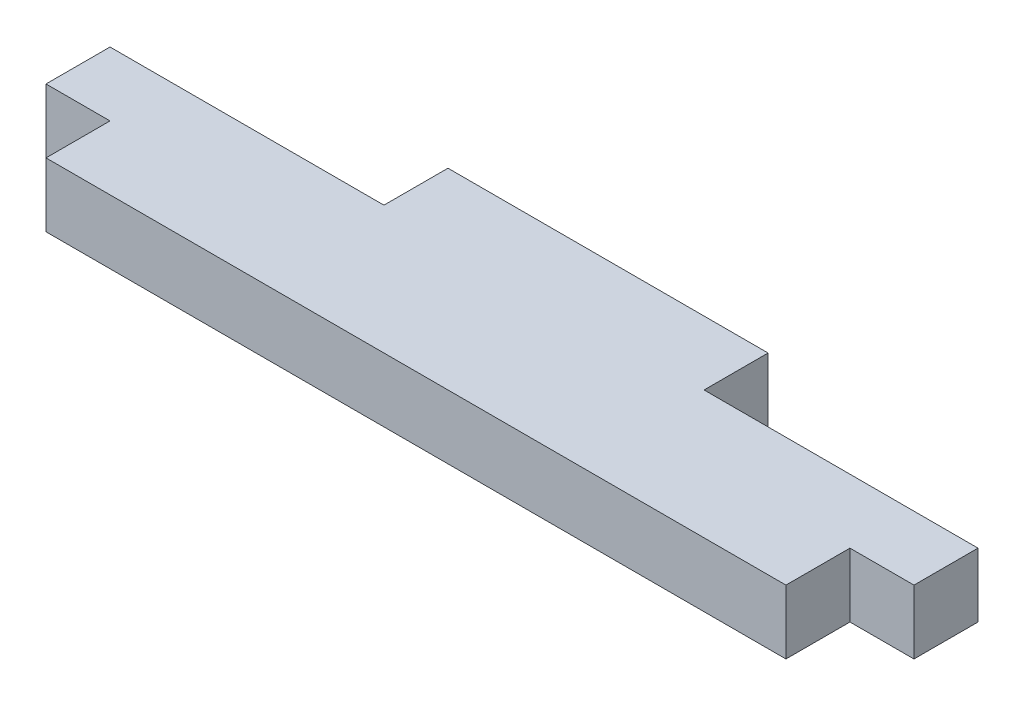
ISO-10303-21;
HEADER;
FILE_DESCRIPTION(('STEP AP214'),'2;1');
FILE_NAME('part.step','',(''),(''),'','','');
FILE_SCHEMA(('AUTOMOTIVE_DESIGN { 1 0 10303 214 1 1 1 1 }'));
ENDSEC;
DATA;
#1=APPLICATION_CONTEXT('core data for automotive mechanical design processes');
#2=APPLICATION_PROTOCOL_DEFINITION('international standard','automotive_design',2000,#1);
#3=PRODUCT_CONTEXT('',#1,'mechanical');
#4=PRODUCT('Part','Part','',(#3));
#5=PRODUCT_RELATED_PRODUCT_CATEGORY('part','',(#4));
#6=PRODUCT_DEFINITION_FORMATION('','',#4);
#7=PRODUCT_DEFINITION_CONTEXT('part definition',#1,'design');
#8=PRODUCT_DEFINITION('design','',#6,#7);
#9=PRODUCT_DEFINITION_SHAPE('','',#8);
#10=(LENGTH_UNIT() NAMED_UNIT(*) SI_UNIT(.MILLI.,.METRE.));
#11=(NAMED_UNIT(*) PLANE_ANGLE_UNIT() SI_UNIT($,.RADIAN.));
#12=(NAMED_UNIT(*) SI_UNIT($,.STERADIAN.) SOLID_ANGLE_UNIT());
#13=UNCERTAINTY_MEASURE_WITH_UNIT(LENGTH_MEASURE(1.E-05),#10,'distance_accuracy_value','');
#14=(GEOMETRIC_REPRESENTATION_CONTEXT(3) GLOBAL_UNCERTAINTY_ASSIGNED_CONTEXT((#13)) GLOBAL_UNIT_ASSIGNED_CONTEXT((#10,
#11,#12)) REPRESENTATION_CONTEXT('',''));
#15=CARTESIAN_POINT('',(0.,0.,0.));
#16=DIRECTION('',(0.,0.,1.));
#17=DIRECTION('',(1.,0.,0.));
#18=AXIS2_PLACEMENT_3D('',#15,#16,#17);
#19=CARTESIAN_POINT('',(0.,0.,0.));
#20=DIRECTION('',(0.,0.,1.));
#21=DIRECTION('',(1.,0.,0.));
#22=AXIS2_PLACEMENT_3D('',#19,#20,#21);
#23=PLANE('',#22);
#24=DIRECTION('',(0.,-1.,0.));
#25=VECTOR('',#24,1.);
#26=CARTESIAN_POINT('',(12.5,-45.,0.));
#27=LINE('',#26,#25);
#28=CARTESIAN_POINT('',(12.5,-45.,0.));
#29=VERTEX_POINT('',#28);
#30=CARTESIAN_POINT('',(12.5,-50.,0.));
#31=VERTEX_POINT('',#30);
#32=EDGE_CURVE('E124',#29,#31,#27,.T.);
#33=ORIENTED_EDGE('',*,*,#32,.F.);
#34=DIRECTION('',(-1.,0.,0.));
#35=VECTOR('',#34,1.);
#36=CARTESIAN_POINT('',(-33.8940421663747,-45.,0.));
#37=LINE('',#36,#35);
#38=CARTESIAN_POINT('',(33.8940421663747,-45.,0.));
#39=VERTEX_POINT('',#38);
#40=EDGE_CURVE('E138',#39,#29,#37,.T.);
#41=ORIENTED_EDGE('',*,*,#40,.F.);
#42=DIRECTION('',(0.,1.,0.));
#43=VECTOR('',#42,1.);
#44=CARTESIAN_POINT('',(33.8940421663747,-45.,0.));
#45=LINE('',#44,#43);
#46=CARTESIAN_POINT('',(33.8940421663747,-50.,0.));
#47=VERTEX_POINT('',#46);
#48=EDGE_CURVE('E154',#47,#39,#45,.T.);
#49=ORIENTED_EDGE('',*,*,#48,.F.);
#50=DIRECTION('',(1.,0.,0.));
#51=VECTOR('',#50,1.);
#52=CARTESIAN_POINT('',(-33.8940421663747,-50.,0.));
#53=LINE('',#52,#51);
#54=EDGE_CURVE('E139',#31,#47,#53,.T.);
#55=ORIENTED_EDGE('',*,*,#54,.F.);
#56=EDGE_LOOP('',(#33,#41,#49,#55));
#57=FACE_BOUND('',#56,.T.);
#58=ADVANCED_FACE('F32',(#57),#23,.F.);
#59=CARTESIAN_POINT('',(0.,0.,5.));
#60=DIRECTION('',(0.,0.,1.));
#61=DIRECTION('',(1.,0.,0.));
#62=AXIS2_PLACEMENT_3D('',#59,#60,#61);
#63=PLANE('',#62);
#64=DIRECTION('',(0.,-1.,0.));
#65=VECTOR('',#64,1.);
#66=CARTESIAN_POINT('',(-28.8940421663747,-45.,5.));
#67=LINE('',#66,#65);
#68=CARTESIAN_POINT('',(-28.8940421663747,-45.,5.));
#69=VERTEX_POINT('',#68);
#70=CARTESIAN_POINT('',(-28.8940421663747,-50.,5.));
#71=VERTEX_POINT('',#70);
#72=EDGE_CURVE('E55',#69,#71,#67,.T.);
#73=ORIENTED_EDGE('',*,*,#72,.F.);
#74=DIRECTION('',(-1.,0.,0.));
#75=VECTOR('',#74,1.);
#76=CARTESIAN_POINT('',(-33.8940421663747,-45.,5.));
#77=LINE('',#76,#75);
#78=CARTESIAN_POINT('',(-33.8940421663747,-45.,5.));
#79=VERTEX_POINT('',#78);
#80=EDGE_CURVE('E178',#69,#79,#77,.T.);
#81=ORIENTED_EDGE('',*,*,#80,.T.);
#82=DIRECTION('',(0.,-1.,0.));
#83=VECTOR('',#82,1.);
#84=CARTESIAN_POINT('',(-33.8940421663747,-45.,5.));
#85=LINE('',#84,#83);
#86=CARTESIAN_POINT('',(-33.8940421663747,-50.,5.));
#87=VERTEX_POINT('',#86);
#88=EDGE_CURVE('E148',#79,#87,#85,.T.);
#89=ORIENTED_EDGE('',*,*,#88,.T.);
#90=DIRECTION('',(1.,0.,0.));
#91=VECTOR('',#90,1.);
#92=CARTESIAN_POINT('',(-33.8940421663747,-50.,5.));
#93=LINE('',#92,#91);
#94=EDGE_CURVE('E180',#87,#71,#93,.T.);
#95=ORIENTED_EDGE('',*,*,#94,.T.);
#96=EDGE_LOOP('',(#73,#81,#89,#95));
#97=FACE_BOUND('',#96,.T.);
#98=ADVANCED_FACE('F230',(#97),#63,.T.);
#99=CARTESIAN_POINT('',(-33.8940421663747,-45.,5.));
#100=DIRECTION('',(1.,0.,0.));
#101=DIRECTION('',(0.,0.,-1.));
#102=AXIS2_PLACEMENT_3D('',#99,#100,#101);
#103=PLANE('',#102);
#104=DIRECTION('',(0.,-1.,0.));
#105=VECTOR('',#104,1.);
#106=CARTESIAN_POINT('',(-33.8940421663747,-45.,0.));
#107=LINE('',#106,#105);
#108=CARTESIAN_POINT('',(-33.8940421663747,-45.,0.));
#109=VERTEX_POINT('',#108);
#110=CARTESIAN_POINT('',(-33.8940421663747,-50.,0.));
#111=VERTEX_POINT('',#110);
#112=EDGE_CURVE('E172',#109,#111,#107,.T.);
#113=ORIENTED_EDGE('',*,*,#112,.T.);
#114=DIRECTION('',(0.,0.,-1.));
#115=VECTOR('',#114,1.);
#116=CARTESIAN_POINT('',(-33.8940421663747,-50.,5.));
#117=LINE('',#116,#115);
#118=EDGE_CURVE('E11',#87,#111,#117,.T.);
#119=ORIENTED_EDGE('',*,*,#118,.F.);
#120=ORIENTED_EDGE('',*,*,#88,.F.);
#121=DIRECTION('',(0.,0.,-1.));
#122=VECTOR('',#121,1.);
#123=CARTESIAN_POINT('',(-33.8940421663747,-45.,5.));
#124=LINE('',#123,#122);
#125=EDGE_CURVE('E158',#79,#109,#124,.T.);
#126=ORIENTED_EDGE('',*,*,#125,.T.);
#127=EDGE_LOOP('',(#113,#119,#120,#126));
#128=FACE_BOUND('',#127,.T.);
#129=ADVANCED_FACE('F34',(#128),#103,.F.);
#130=CARTESIAN_POINT('',(-33.8940421663747,-50.,5.));
#131=DIRECTION('',(0.,1.,0.));
#132=DIRECTION('',(0.,0.,1.));
#133=AXIS2_PLACEMENT_3D('',#130,#131,#132);
#134=PLANE('',#133);
#135=CARTESIAN_POINT('',(-12.5,-50.,0.));
#136=VERTEX_POINT('',#135);
#137=EDGE_CURVE('E170',#111,#136,#53,.T.);
#138=ORIENTED_EDGE('',*,*,#137,.T.);
#139=DIRECTION('',(0.,0.,-1.));
#140=VECTOR('',#139,1.);
#141=CARTESIAN_POINT('',(-12.5,-50.,0.));
#142=LINE('',#141,#140);
#143=CARTESIAN_POINT('',(-12.5,-50.,-5.));
#144=VERTEX_POINT('',#143);
#145=EDGE_CURVE('E47',#136,#144,#142,.T.);
#146=ORIENTED_EDGE('',*,*,#145,.T.);
#147=DIRECTION('',(1.,0.,0.));
#148=VECTOR('',#147,1.);
#149=CARTESIAN_POINT('',(12.5,-50.,-4.99999999999999));
#150=LINE('',#149,#148);
#151=CARTESIAN_POINT('',(12.5,-50.,-4.99999999999999));
#152=VERTEX_POINT('',#151);
#153=EDGE_CURVE('E132',#144,#152,#150,.T.);
#154=ORIENTED_EDGE('',*,*,#153,.T.);
#155=DIRECTION('',(0.,0.,1.));
#156=VECTOR('',#155,1.);
#157=CARTESIAN_POINT('',(12.5,-50.,0.));
#158=LINE('',#157,#156);
#159=EDGE_CURVE('E213',#152,#31,#158,.T.);
#160=ORIENTED_EDGE('',*,*,#159,.T.);
#161=ORIENTED_EDGE('',*,*,#54,.T.);
#162=DIRECTION('',(0.,0.,-1.));
#163=VECTOR('',#162,1.);
#164=CARTESIAN_POINT('',(33.8940421663747,-50.,5.));
#165=LINE('',#164,#163);
#166=CARTESIAN_POINT('',(33.8940421663747,-50.,5.));
#167=VERTEX_POINT('',#166);
#168=EDGE_CURVE('E40',#167,#47,#165,.T.);
#169=ORIENTED_EDGE('',*,*,#168,.F.);
#170=CARTESIAN_POINT('',(28.8940421663747,-50.,5.));
#171=VERTEX_POINT('',#170);
#172=EDGE_CURVE('E152',#171,#167,#93,.T.);
#173=ORIENTED_EDGE('',*,*,#172,.F.);
#174=DIRECTION('',(0.,0.,-1.));
#175=VECTOR('',#174,1.);
#176=CARTESIAN_POINT('',(28.8940421663747,-50.,10.));
#177=LINE('',#176,#175);
#178=CARTESIAN_POINT('',(28.8940421663747,-50.,10.));
#179=VERTEX_POINT('',#178);
#180=EDGE_CURVE('E184',#179,#171,#177,.T.);
#181=ORIENTED_EDGE('',*,*,#180,.F.);
#182=DIRECTION('',(1.,0.,0.));
#183=VECTOR('',#182,1.);
#184=CARTESIAN_POINT('',(-28.8940421663747,-50.,10.));
#185=LINE('',#184,#183);
#186=CARTESIAN_POINT('',(-28.8940421663747,-50.,10.));
#187=VERTEX_POINT('',#186);
#188=EDGE_CURVE('E202',#187,#179,#185,.T.);
#189=ORIENTED_EDGE('',*,*,#188,.F.);
#190=DIRECTION('',(0.,0.,-1.));
#191=VECTOR('',#190,1.);
#192=CARTESIAN_POINT('',(-28.8940421663747,-50.,10.));
#193=LINE('',#192,#191);
#194=EDGE_CURVE('E176',#187,#71,#193,.T.);
#195=ORIENTED_EDGE('',*,*,#194,.T.);
#196=ORIENTED_EDGE('',*,*,#94,.F.);
#197=ORIENTED_EDGE('',*,*,#118,.T.);
#198=EDGE_LOOP('',(#138,#146,#154,#160,#161,#169,#173,#181,#189,#195,#196,#197));
#199=FACE_BOUND('',#198,.T.);
#200=ADVANCED_FACE('F223',(#199),#134,.F.);
#201=CARTESIAN_POINT('',(33.8940421663747,-45.,5.));
#202=DIRECTION('',(-1.,0.,0.));
#203=DIRECTION('',(0.,0.,1.));
#204=AXIS2_PLACEMENT_3D('',#201,#202,#203);
#205=PLANE('',#204);
#206=ORIENTED_EDGE('',*,*,#48,.T.);
#207=DIRECTION('',(0.,0.,-1.));
#208=VECTOR('',#207,1.);
#209=CARTESIAN_POINT('',(33.8940421663747,-45.,5.));
#210=LINE('',#209,#208);
#211=CARTESIAN_POINT('',(33.8940421663747,-45.,5.));
#212=VERTEX_POINT('',#211);
#213=EDGE_CURVE('E147',#212,#39,#210,.T.);
#214=ORIENTED_EDGE('',*,*,#213,.F.);
#215=DIRECTION('',(0.,1.,0.));
#216=VECTOR('',#215,1.);
#217=CARTESIAN_POINT('',(33.8940421663747,-45.,5.));
#218=LINE('',#217,#216);
#219=EDGE_CURVE('E167',#167,#212,#218,.T.);
#220=ORIENTED_EDGE('',*,*,#219,.F.);
#221=ORIENTED_EDGE('',*,*,#168,.T.);
#222=EDGE_LOOP('',(#206,#214,#220,#221));
#223=FACE_BOUND('',#222,.T.);
#224=ADVANCED_FACE('F166',(#223),#205,.F.);
#225=CARTESIAN_POINT('',(-33.8940421663747,-45.,5.));
#226=DIRECTION('',(0.,-1.,0.));
#227=DIRECTION('',(0.,0.,-1.));
#228=AXIS2_PLACEMENT_3D('',#225,#226,#227);
#229=PLANE('',#228);
#230=ORIENTED_EDGE('',*,*,#40,.T.);
#231=DIRECTION('',(0.,0.,1.));
#232=VECTOR('',#231,1.);
#233=CARTESIAN_POINT('',(12.5,-45.,0.));
#234=LINE('',#233,#232);
#235=CARTESIAN_POINT('',(12.5,-45.,-4.99999999999999));
#236=VERTEX_POINT('',#235);
#237=EDGE_CURVE('E120',#236,#29,#234,.T.);
#238=ORIENTED_EDGE('',*,*,#237,.F.);
#239=DIRECTION('',(1.,0.,0.));
#240=VECTOR('',#239,1.);
#241=CARTESIAN_POINT('',(12.5,-45.,-4.99999999999999));
#242=LINE('',#241,#240);
#243=CARTESIAN_POINT('',(-12.5,-45.,-5.));
#244=VERTEX_POINT('',#243);
#245=EDGE_CURVE('E141',#244,#236,#242,.T.);
#246=ORIENTED_EDGE('',*,*,#245,.F.);
#247=DIRECTION('',(0.,0.,-1.));
#248=VECTOR('',#247,1.);
#249=CARTESIAN_POINT('',(-12.5,-45.,0.));
#250=LINE('',#249,#248);
#251=CARTESIAN_POINT('',(-12.5,-45.,0.));
#252=VERTEX_POINT('',#251);
#253=EDGE_CURVE('E131',#252,#244,#250,.T.);
#254=ORIENTED_EDGE('',*,*,#253,.F.);
#255=EDGE_CURVE('E149',#252,#109,#37,.T.);
#256=ORIENTED_EDGE('',*,*,#255,.T.);
#257=ORIENTED_EDGE('',*,*,#125,.F.);
#258=ORIENTED_EDGE('',*,*,#80,.F.);
#259=DIRECTION('',(0.,0.,-1.));
#260=VECTOR('',#259,1.);
#261=CARTESIAN_POINT('',(-28.8940421663747,-45.,10.));
#262=LINE('',#261,#260);
#263=CARTESIAN_POINT('',(-28.8940421663747,-45.,10.));
#264=VERTEX_POINT('',#263);
#265=EDGE_CURVE('E190',#264,#69,#262,.T.);
#266=ORIENTED_EDGE('',*,*,#265,.F.);
#267=DIRECTION('',(-1.,0.,0.));
#268=VECTOR('',#267,1.);
#269=CARTESIAN_POINT('',(-28.8940421663747,-45.,10.));
#270=LINE('',#269,#268);
#271=CARTESIAN_POINT('',(28.8940421663747,-45.,10.));
#272=VERTEX_POINT('',#271);
#273=EDGE_CURVE('E193',#272,#264,#270,.T.);
#274=ORIENTED_EDGE('',*,*,#273,.F.);
#275=DIRECTION('',(0.,0.,-1.));
#276=VECTOR('',#275,1.);
#277=CARTESIAN_POINT('',(28.8940421663747,-45.,10.));
#278=LINE('',#277,#276);
#279=CARTESIAN_POINT('',(28.8940421663747,-45.,5.));
#280=VERTEX_POINT('',#279);
#281=EDGE_CURVE('E187',#272,#280,#278,.T.);
#282=ORIENTED_EDGE('',*,*,#281,.T.);
#283=EDGE_CURVE('E161',#212,#280,#77,.T.);
#284=ORIENTED_EDGE('',*,*,#283,.F.);
#285=ORIENTED_EDGE('',*,*,#213,.T.);
#286=EDGE_LOOP('',(#230,#238,#246,#254,#256,#257,#258,#266,#274,#282,#284,#285));
#287=FACE_BOUND('',#286,.T.);
#288=ADVANCED_FACE('F144',(#287),#229,.F.);
#289=DIRECTION('',(0.,1.,0.));
#290=VECTOR('',#289,1.);
#291=CARTESIAN_POINT('',(28.8940421663747,-45.,5.));
#292=LINE('',#291,#290);
#293=EDGE_CURVE('E194',#171,#280,#292,.T.);
#294=ORIENTED_EDGE('',*,*,#293,.F.);
#295=ORIENTED_EDGE('',*,*,#172,.T.);
#296=ORIENTED_EDGE('',*,*,#219,.T.);
#297=ORIENTED_EDGE('',*,*,#283,.T.);
#298=EDGE_LOOP('',(#294,#295,#296,#297));
#299=FACE_BOUND('',#298,.T.);
#300=ADVANCED_FACE('F239',(#299),#63,.T.);
#301=ORIENTED_EDGE('',*,*,#255,.F.);
#302=DIRECTION('',(0.,-1.,0.));
#303=VECTOR('',#302,1.);
#304=CARTESIAN_POINT('',(-12.5,-45.,0.));
#305=LINE('',#304,#303);
#306=EDGE_CURVE('E140',#252,#136,#305,.T.);
#307=ORIENTED_EDGE('',*,*,#306,.T.);
#308=ORIENTED_EDGE('',*,*,#137,.F.);
#309=ORIENTED_EDGE('',*,*,#112,.F.);
#310=EDGE_LOOP('',(#301,#307,#308,#309));
#311=FACE_BOUND('',#310,.T.);
#312=ADVANCED_FACE('F234',(#311),#23,.F.);
#313=CARTESIAN_POINT('',(-28.8940421663747,-45.,10.));
#314=DIRECTION('',(1.,0.,0.));
#315=DIRECTION('',(0.,0.,-1.));
#316=AXIS2_PLACEMENT_3D('',#313,#314,#315);
#317=PLANE('',#316);
#318=ORIENTED_EDGE('',*,*,#72,.T.);
#319=ORIENTED_EDGE('',*,*,#194,.F.);
#320=DIRECTION('',(0.,-1.,0.));
#321=VECTOR('',#320,1.);
#322=CARTESIAN_POINT('',(-28.8940421663747,-45.,10.));
#323=LINE('',#322,#321);
#324=EDGE_CURVE('E197',#264,#187,#323,.T.);
#325=ORIENTED_EDGE('',*,*,#324,.F.);
#326=ORIENTED_EDGE('',*,*,#265,.T.);
#327=EDGE_LOOP('',(#318,#319,#325,#326));
#328=FACE_BOUND('',#327,.T.);
#329=ADVANCED_FACE('F242',(#328),#317,.F.);
#330=CARTESIAN_POINT('',(28.8940421663747,-45.,10.));
#331=DIRECTION('',(-1.,0.,0.));
#332=DIRECTION('',(0.,0.,1.));
#333=AXIS2_PLACEMENT_3D('',#330,#331,#332);
#334=PLANE('',#333);
#335=ORIENTED_EDGE('',*,*,#293,.T.);
#336=ORIENTED_EDGE('',*,*,#281,.F.);
#337=DIRECTION('',(0.,1.,0.));
#338=VECTOR('',#337,1.);
#339=CARTESIAN_POINT('',(28.8940421663747,-45.,10.));
#340=LINE('',#339,#338);
#341=EDGE_CURVE('E200',#179,#272,#340,.T.);
#342=ORIENTED_EDGE('',*,*,#341,.F.);
#343=ORIENTED_EDGE('',*,*,#180,.T.);
#344=EDGE_LOOP('',(#335,#336,#342,#343));
#345=FACE_BOUND('',#344,.T.);
#346=ADVANCED_FACE('F248',(#345),#334,.F.);
#347=CARTESIAN_POINT('',(0.,0.,10.));
#348=DIRECTION('',(0.,0.,1.));
#349=DIRECTION('',(1.,0.,0.));
#350=AXIS2_PLACEMENT_3D('',#347,#348,#349);
#351=PLANE('',#350);
#352=ORIENTED_EDGE('',*,*,#324,.T.);
#353=ORIENTED_EDGE('',*,*,#188,.T.);
#354=ORIENTED_EDGE('',*,*,#341,.T.);
#355=ORIENTED_EDGE('',*,*,#273,.T.);
#356=EDGE_LOOP('',(#352,#353,#354,#355));
#357=FACE_BOUND('',#356,.T.);
#358=ADVANCED_FACE('F261',(#357),#351,.T.);
#359=CARTESIAN_POINT('',(12.5,-45.,0.));
#360=DIRECTION('',(1.,0.,0.));
#361=DIRECTION('',(0.,0.,-1.));
#362=AXIS2_PLACEMENT_3D('',#359,#360,#361);
#363=PLANE('',#362);
#364=ORIENTED_EDGE('',*,*,#159,.F.);
#365=DIRECTION('',(0.,-1.,0.));
#366=VECTOR('',#365,1.);
#367=CARTESIAN_POINT('',(12.5,-45.,-4.99999999999999));
#368=LINE('',#367,#366);
#369=EDGE_CURVE('E126',#236,#152,#368,.T.);
#370=ORIENTED_EDGE('',*,*,#369,.F.);
#371=ORIENTED_EDGE('',*,*,#237,.T.);
#372=ORIENTED_EDGE('',*,*,#32,.T.);
#373=EDGE_LOOP('',(#364,#370,#371,#372));
#374=FACE_BOUND('',#373,.T.);
#375=ADVANCED_FACE('F123',(#374),#363,.T.);
#376=CARTESIAN_POINT('',(12.5,-45.,-4.99999999999999));
#377=DIRECTION('',(0.,0.,-1.));
#378=DIRECTION('',(-1.,0.,0.));
#379=AXIS2_PLACEMENT_3D('',#376,#377,#378);
#380=PLANE('',#379);
#381=ORIENTED_EDGE('',*,*,#153,.F.);
#382=DIRECTION('',(0.,-1.,0.));
#383=VECTOR('',#382,1.);
#384=CARTESIAN_POINT('',(-12.5,-45.,-5.));
#385=LINE('',#384,#383);
#386=EDGE_CURVE('E207',#244,#144,#385,.T.);
#387=ORIENTED_EDGE('',*,*,#386,.F.);
#388=ORIENTED_EDGE('',*,*,#245,.T.);
#389=ORIENTED_EDGE('',*,*,#369,.T.);
#390=EDGE_LOOP('',(#381,#387,#388,#389));
#391=FACE_BOUND('',#390,.T.);
#392=ADVANCED_FACE('F222',(#391),#380,.T.);
#393=CARTESIAN_POINT('',(-12.5,-45.,0.));
#394=DIRECTION('',(-1.,0.,0.));
#395=DIRECTION('',(0.,0.,1.));
#396=AXIS2_PLACEMENT_3D('',#393,#394,#395);
#397=PLANE('',#396);
#398=ORIENTED_EDGE('',*,*,#145,.F.);
#399=ORIENTED_EDGE('',*,*,#306,.F.);
#400=ORIENTED_EDGE('',*,*,#253,.T.);
#401=ORIENTED_EDGE('',*,*,#386,.T.);
#402=EDGE_LOOP('',(#398,#399,#400,#401));
#403=FACE_BOUND('',#402,.T.);
#404=ADVANCED_FACE('F218',(#403),#397,.T.);
#405=CLOSED_SHELL('',(#58,#98,#129,#200,#224,#288,#300,#312,#329,#346,#358,#375,#392,#404));
#406=MANIFOLD_SOLID_BREP('B2',#405);
#407=ADVANCED_BREP_SHAPE_REPRESENTATION('',(#18,#406),#14);
#408=SHAPE_DEFINITION_REPRESENTATION(#9,#407);
ENDSEC;
END-ISO-10303-21;
